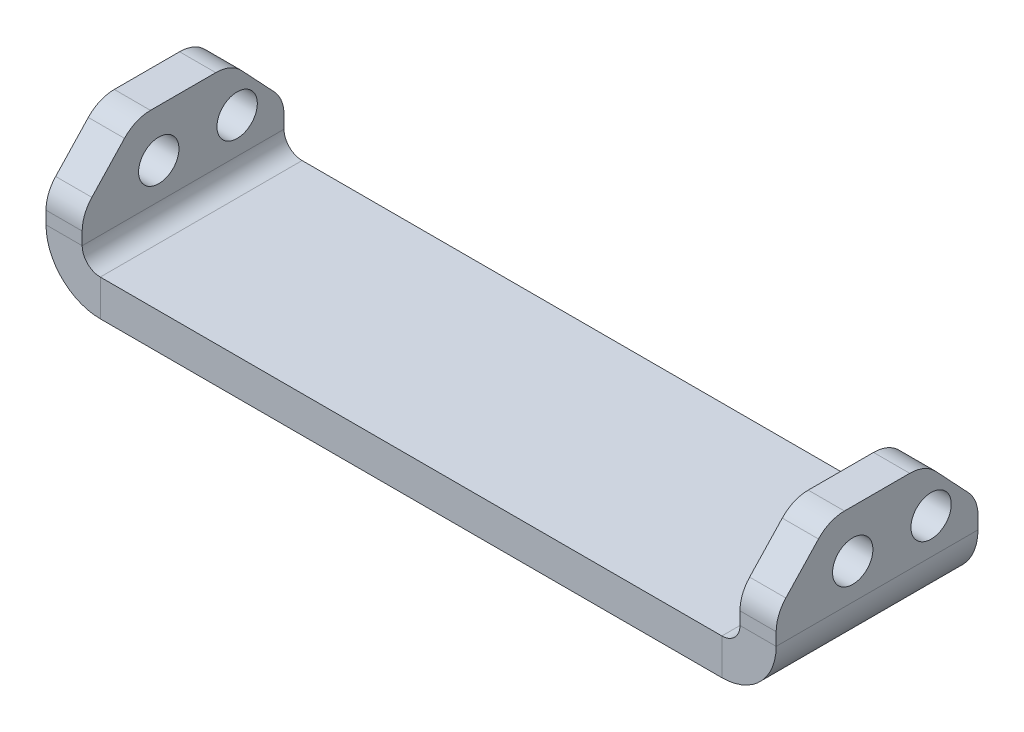
ISO-10303-21;
HEADER;
FILE_DESCRIPTION(('STEP AP214'),'2;1');
FILE_NAME('part.step','',(''),(''),'','','');
FILE_SCHEMA(('AUTOMOTIVE_DESIGN { 1 0 10303 214 1 1 1 1 }'));
ENDSEC;
DATA;
#1=APPLICATION_CONTEXT('core data for automotive mechanical design processes');
#2=APPLICATION_PROTOCOL_DEFINITION('international standard','automotive_design',2000,#1);
#3=PRODUCT_CONTEXT('',#1,'mechanical');
#4=PRODUCT('Part','Part','',(#3));
#5=PRODUCT_RELATED_PRODUCT_CATEGORY('part','',(#4));
#6=PRODUCT_DEFINITION_FORMATION('','',#4);
#7=PRODUCT_DEFINITION_CONTEXT('part definition',#1,'design');
#8=PRODUCT_DEFINITION('design','',#6,#7);
#9=PRODUCT_DEFINITION_SHAPE('','',#8);
#10=(LENGTH_UNIT() NAMED_UNIT(*) SI_UNIT(.MILLI.,.METRE.));
#11=(NAMED_UNIT(*) PLANE_ANGLE_UNIT() SI_UNIT($,.RADIAN.));
#12=(NAMED_UNIT(*) SI_UNIT($,.STERADIAN.) SOLID_ANGLE_UNIT());
#13=UNCERTAINTY_MEASURE_WITH_UNIT(LENGTH_MEASURE(1.E-05),#10,'distance_accuracy_value','');
#14=(GEOMETRIC_REPRESENTATION_CONTEXT(3) GLOBAL_UNCERTAINTY_ASSIGNED_CONTEXT((#13)) GLOBAL_UNIT_ASSIGNED_CONTEXT((#10,
#11,#12)) REPRESENTATION_CONTEXT('',''));
#15=CARTESIAN_POINT('',(0.,0.,0.));
#16=DIRECTION('',(0.,0.,1.));
#17=DIRECTION('',(1.,0.,0.));
#18=AXIS2_PLACEMENT_3D('',#15,#16,#17);
#19=CARTESIAN_POINT('',(0.,15.952,0.));
#20=DIRECTION('',(0.,0.,-1.));
#21=DIRECTION('',(-1.,0.,0.));
#22=AXIS2_PLACEMENT_3D('',#19,#20,#21);
#23=PLANE('',#22);
#24=DIRECTION('',(-1.,0.,0.));
#25=VECTOR('',#24,1.);
#26=CARTESIAN_POINT('',(0.,2.59399999999999,0.));
#27=LINE('',#26,#25);
#28=CARTESIAN_POINT('',(0.,2.59399999999999,0.));
#29=VERTEX_POINT('',#28);
#30=CARTESIAN_POINT('',(3.04799999999999,2.594,0.));
#31=VERTEX_POINT('',#30);
#32=EDGE_CURVE('E95',#29,#31,#27,.F.);
#33=ORIENTED_EDGE('',*,*,#32,.F.);
#34=DIRECTION('',(0.,1.,0.));
#35=VECTOR('',#34,1.);
#36=CARTESIAN_POINT('',(0.,0.,0.));
#37=LINE('',#36,#35);
#38=CARTESIAN_POINT('',(0.,1.52399999999998,0.));
#39=VERTEX_POINT('',#38);
#40=EDGE_CURVE('E313',#39,#29,#37,.T.);
#41=ORIENTED_EDGE('',*,*,#40,.F.);
#42=DIRECTION('',(1.,0.,0.));
#43=VECTOR('',#42,1.);
#44=CARTESIAN_POINT('',(3.04799999999999,1.52399999999999,0.));
#45=LINE('',#44,#43);
#46=CARTESIAN_POINT('',(3.04799999999999,1.52399999999999,0.));
#47=VERTEX_POINT('',#46);
#48=EDGE_CURVE('E324',#47,#39,#45,.F.);
#49=ORIENTED_EDGE('',*,*,#48,.F.);
#50=DIRECTION('',(0.,-1.,0.));
#51=VECTOR('',#50,1.);
#52=CARTESIAN_POINT('',(3.04799999999994,15.952,0.));
#53=LINE('',#52,#51);
#54=EDGE_CURVE('E318',#47,#31,#53,.F.);
#55=ORIENTED_EDGE('',*,*,#54,.T.);
#56=EDGE_LOOP('',(#33,#41,#49,#55));
#57=FACE_BOUND('',#56,.T.);
#58=ADVANCED_FACE('F78',(#57),#23,.F.);
#59=CARTESIAN_POINT('',(0.,0.,0.));
#60=DIRECTION('',(1.,0.,0.));
#61=DIRECTION('',(0.,1.,0.));
#62=AXIS2_PLACEMENT_3D('',#59,#60,#61);
#63=PLANE('',#62);
#64=CARTESIAN_POINT('',(0.,4.52399999999998,-13.05));
#65=DIRECTION('',(-1.,0.,0.));
#66=DIRECTION('',(0.,0.,1.));
#67=AXIS2_PLACEMENT_3D('',#64,#65,#66);
#68=CIRCLE('',#67,1.69999999999999);
#69=CARTESIAN_POINT('',(0.,4.52399999999998,-11.35));
#70=VERTEX_POINT('',#69);
#71=EDGE_CURVE('E941',#70,#70,#68,.T.);
#72=ORIENTED_EDGE('',*,*,#71,.F.);
#73=EDGE_LOOP('',(#72));
#74=FACE_BOUND('',#73,.T.);
#75=CARTESIAN_POINT('',(0.,4.52399999999998,-6.45));
#76=DIRECTION('',(-1.,0.,0.));
#77=DIRECTION('',(0.,0.,1.));
#78=AXIS2_PLACEMENT_3D('',#75,#76,#77);
#79=CIRCLE('',#78,1.69999999999999);
#80=CARTESIAN_POINT('',(0.,4.52399999999998,-4.75000000000001));
#81=VERTEX_POINT('',#80);
#82=EDGE_CURVE('E370',#81,#81,#79,.T.);
#83=ORIENTED_EDGE('',*,*,#82,.F.);
#84=EDGE_LOOP('',(#83));
#85=FACE_BOUND('',#84,.T.);
#86=CARTESIAN_POINT('',(0.,2.59399999999999,-14.));
#87=DIRECTION('',(-1.,0.,0.));
#88=DIRECTION('',(0.,0.,1.));
#89=AXIS2_PLACEMENT_3D('',#86,#87,#88);
#90=CIRCLE('',#89,3.);
#91=CARTESIAN_POINT('',(0.,4.647064751228,-16.1874471713084));
#92=VERTEX_POINT('',#91);
#93=CARTESIAN_POINT('',(0.,2.59399999999999,-17.));
#94=VERTEX_POINT('',#93);
#95=EDGE_CURVE('E445',#92,#94,#90,.T.);
#96=ORIENTED_EDGE('',*,*,#95,.T.);
#97=DIRECTION('',(0.,-1.,0.));
#98=VECTOR('',#97,1.);
#99=CARTESIAN_POINT('',(0.,0.,-17.));
#100=LINE('',#99,#98);
#101=CARTESIAN_POINT('',(0.,1.52399999999998,-17.));
#102=VERTEX_POINT('',#101);
#103=EDGE_CURVE('E310',#94,#102,#100,.T.);
#104=ORIENTED_EDGE('',*,*,#103,.T.);
#105=DIRECTION('',(0.,0.,1.));
#106=VECTOR('',#105,1.);
#107=CARTESIAN_POINT('',(0.,1.52399999999998,-17.));
#108=LINE('',#107,#106);
#109=EDGE_CURVE('E321',#39,#102,#108,.F.);
#110=ORIENTED_EDGE('',*,*,#109,.F.);
#111=ORIENTED_EDGE('',*,*,#40,.T.);
#112=CARTESIAN_POINT('',(0.,2.59399999999999,-3.));
#113=DIRECTION('',(-1.,0.,0.));
#114=DIRECTION('',(0.,0.,1.));
#115=AXIS2_PLACEMENT_3D('',#112,#113,#114);
#116=CIRCLE('',#115,3.);
#117=CARTESIAN_POINT('',(0.,4.647064751228,-0.812552828691611));
#118=VERTEX_POINT('',#117);
#119=EDGE_CURVE('E442',#29,#118,#116,.T.);
#120=ORIENTED_EDGE('',*,*,#119,.T.);
#121=DIRECTION('',(0.,-0.729149057102796,0.684354917076003));
#122=VECTOR('',#121,1.);
#123=CARTESIAN_POINT('',(0.,7.577064751228,-3.56255282869161));
#124=LINE('',#123,#122);
#125=CARTESIAN_POINT('',(0.,7.577064751228,-3.56255282869161));
#126=VERTEX_POINT('',#125);
#127=EDGE_CURVE('E367',#118,#126,#124,.F.);
#128=ORIENTED_EDGE('',*,*,#127,.T.);
#129=CARTESIAN_POINT('',(0.,5.52399999999999,-5.75));
#130=DIRECTION('',(-1.,0.,0.));
#131=DIRECTION('',(0.,0.,1.));
#132=AXIS2_PLACEMENT_3D('',#129,#130,#131);
#133=CIRCLE('',#132,3.);
#134=CARTESIAN_POINT('',(0.,8.52399999999999,-5.75));
#135=VERTEX_POINT('',#134);
#136=EDGE_CURVE('E428',#126,#135,#133,.T.);
#137=ORIENTED_EDGE('',*,*,#136,.T.);
#138=DIRECTION('',(0.,0.,1.));
#139=VECTOR('',#138,1.);
#140=CARTESIAN_POINT('',(0.,8.52399999999999,0.));
#141=LINE('',#140,#139);
#142=CARTESIAN_POINT('',(0.,8.52399999999999,-11.25));
#143=VERTEX_POINT('',#142);
#144=EDGE_CURVE('E454',#135,#143,#141,.F.);
#145=ORIENTED_EDGE('',*,*,#144,.T.);
#146=CARTESIAN_POINT('',(0.,5.52399999999999,-11.25));
#147=DIRECTION('',(-1.,0.,0.));
#148=DIRECTION('',(0.,0.,1.));
#149=AXIS2_PLACEMENT_3D('',#146,#147,#148);
#150=CIRCLE('',#149,3.);
#151=CARTESIAN_POINT('',(0.,7.577064751228,-13.4374471713084));
#152=VERTEX_POINT('',#151);
#153=EDGE_CURVE('E451',#143,#152,#150,.T.);
#154=ORIENTED_EDGE('',*,*,#153,.T.);
#155=DIRECTION('',(0.,0.729149057102796,0.684354917076003));
#156=VECTOR('',#155,1.);
#157=CARTESIAN_POINT('',(0.,4.64706475122799,-16.1874471713084));
#158=LINE('',#157,#156);
#159=EDGE_CURVE('E448',#152,#92,#158,.F.);
#160=ORIENTED_EDGE('',*,*,#159,.T.);
#161=EDGE_LOOP('',(#96,#104,#110,#111,#120,#128,#137,#145,#154,#160));
#162=FACE_BOUND('',#161,.T.);
#163=ADVANCED_FACE('F500',(#74,#85,#162),#63,.F.);
#164=CARTESIAN_POINT('',(3.048,0.,0.));
#165=DIRECTION('',(1.,0.,0.));
#166=DIRECTION('',(0.,1.,0.));
#167=AXIS2_PLACEMENT_3D('',#164,#165,#166);
#168=PLANE('',#167);
#169=CARTESIAN_POINT('',(3.04799999999998,4.52399999999998,-13.05));
#170=DIRECTION('',(1.,0.,0.));
#171=DIRECTION('',(0.,1.,0.));
#172=AXIS2_PLACEMENT_3D('',#169,#170,#171);
#173=CIRCLE('',#172,1.69999999999999);
#174=CARTESIAN_POINT('',(3.04799999999998,6.22399999999997,-13.05));
#175=VERTEX_POINT('',#174);
#176=EDGE_CURVE('E82',#175,#175,#173,.T.);
#177=ORIENTED_EDGE('',*,*,#176,.F.);
#178=EDGE_LOOP('',(#177));
#179=FACE_BOUND('',#178,.T.);
#180=CARTESIAN_POINT('',(3.04799999999998,4.52399999999998,-6.45));
#181=DIRECTION('',(1.,0.,0.));
#182=DIRECTION('',(0.,1.,0.));
#183=AXIS2_PLACEMENT_3D('',#180,#181,#182);
#184=CIRCLE('',#183,1.69999999999999);
#185=CARTESIAN_POINT('',(3.04799999999998,6.22399999999997,-6.45));
#186=VERTEX_POINT('',#185);
#187=EDGE_CURVE('E362',#186,#186,#184,.T.);
#188=ORIENTED_EDGE('',*,*,#187,.F.);
#189=EDGE_LOOP('',(#188));
#190=FACE_BOUND('',#189,.T.);
#191=DIRECTION('',(0.,1.,0.));
#192=VECTOR('',#191,1.);
#193=CARTESIAN_POINT('',(3.048,0.,-17.));
#194=LINE('',#193,#192);
#195=CARTESIAN_POINT('',(3.04799999999999,2.594,-17.));
#196=VERTEX_POINT('',#195);
#197=CARTESIAN_POINT('',(3.04799999999999,1.52399999999999,-17.));
#198=VERTEX_POINT('',#197);
#199=EDGE_CURVE('E316',#196,#198,#194,.F.);
#200=ORIENTED_EDGE('',*,*,#199,.F.);
#201=CARTESIAN_POINT('',(3.04799999999999,2.594,-14.));
#202=DIRECTION('',(-1.,0.,0.));
#203=DIRECTION('',(0.,0.,1.));
#204=AXIS2_PLACEMENT_3D('',#201,#202,#203);
#205=CIRCLE('',#204,3.);
#206=CARTESIAN_POINT('',(3.04799999999998,4.64706475122801,-16.1874471713084));
#207=VERTEX_POINT('',#206);
#208=EDGE_CURVE('E437',#207,#196,#205,.T.);
#209=ORIENTED_EDGE('',*,*,#208,.F.);
#210=DIRECTION('',(0.,0.729149057102796,0.684354917076003));
#211=VECTOR('',#210,1.);
#212=CARTESIAN_POINT('',(3.04799999999998,4.647064751228,-16.1874471713084));
#213=LINE('',#212,#211);
#214=CARTESIAN_POINT('',(3.04799999999997,7.57706475122801,-13.4374471713084));
#215=VERTEX_POINT('',#214);
#216=EDGE_CURVE('E435',#215,#207,#213,.F.);
#217=ORIENTED_EDGE('',*,*,#216,.F.);
#218=CARTESIAN_POINT('',(3.04799999999997,5.524,-11.25));
#219=DIRECTION('',(-1.,0.,0.));
#220=DIRECTION('',(0.,0.,1.));
#221=AXIS2_PLACEMENT_3D('',#218,#219,#220);
#222=CIRCLE('',#221,3.);
#223=CARTESIAN_POINT('',(3.04799999999997,8.524,-11.25));
#224=VERTEX_POINT('',#223);
#225=EDGE_CURVE('E433',#224,#215,#222,.T.);
#226=ORIENTED_EDGE('',*,*,#225,.F.);
#227=DIRECTION('',(0.,0.,1.));
#228=VECTOR('',#227,1.);
#229=CARTESIAN_POINT('',(3.04799999999997,8.524,0.));
#230=LINE('',#229,#228);
#231=CARTESIAN_POINT('',(3.04799999999997,8.524,-5.75));
#232=VERTEX_POINT('',#231);
#233=EDGE_CURVE('E431',#232,#224,#230,.F.);
#234=ORIENTED_EDGE('',*,*,#233,.F.);
#235=CARTESIAN_POINT('',(3.04799999999997,5.524,-5.75));
#236=DIRECTION('',(-1.,0.,0.));
#237=DIRECTION('',(0.,0.,1.));
#238=AXIS2_PLACEMENT_3D('',#235,#236,#237);
#239=CIRCLE('',#238,3.);
#240=CARTESIAN_POINT('',(3.04799999999997,7.57706475122801,-3.56255282869161));
#241=VERTEX_POINT('',#240);
#242=EDGE_CURVE('E429',#241,#232,#239,.T.);
#243=ORIENTED_EDGE('',*,*,#242,.F.);
#244=DIRECTION('',(0.,-0.729149057102796,0.684354917076003));
#245=VECTOR('',#244,1.);
#246=CARTESIAN_POINT('',(3.04799999999997,7.57706475122801,-3.56255282869161));
#247=LINE('',#246,#245);
#248=CARTESIAN_POINT('',(3.04799999999998,4.64706475122801,-0.812552828691611));
#249=VERTEX_POINT('',#248);
#250=EDGE_CURVE('E425',#249,#241,#247,.F.);
#251=ORIENTED_EDGE('',*,*,#250,.F.);
#252=CARTESIAN_POINT('',(3.04799999999999,2.594,-3.));
#253=DIRECTION('',(-1.,0.,0.));
#254=DIRECTION('',(0.,0.,1.));
#255=AXIS2_PLACEMENT_3D('',#252,#253,#254);
#256=CIRCLE('',#255,3.);
#257=EDGE_CURVE('E427',#31,#249,#256,.T.);
#258=ORIENTED_EDGE('',*,*,#257,.F.);
#259=ORIENTED_EDGE('',*,*,#54,.F.);
#260=DIRECTION('',(0.,0.,1.));
#261=VECTOR('',#260,1.);
#262=CARTESIAN_POINT('',(3.04799999999999,1.52399999999999,-17.));
#263=LINE('',#262,#261);
#264=EDGE_CURVE('E327',#198,#47,#263,.T.);
#265=ORIENTED_EDGE('',*,*,#264,.F.);
#266=EDGE_LOOP('',(#200,#209,#217,#226,#234,#243,#251,#258,#259,#265));
#267=FACE_BOUND('',#266,.T.);
#268=ADVANCED_FACE('F485',(#179,#190,#267),#168,.T.);
#269=CARTESIAN_POINT('',(61.5,15.952,-17.));
#270=DIRECTION('',(0.,0.,1.));
#271=DIRECTION('',(0.,-1.,0.));
#272=AXIS2_PLACEMENT_3D('',#269,#270,#271);
#273=PLANE('',#272);
#274=DIRECTION('',(-1.,0.,0.));
#275=VECTOR('',#274,1.);
#276=CARTESIAN_POINT('',(58.452,2.59399999999999,-17.));
#277=LINE('',#276,#275);
#278=CARTESIAN_POINT('',(58.452,2.59399999999999,-17.));
#279=VERTEX_POINT('',#278);
#280=CARTESIAN_POINT('',(61.5,2.59399999999998,-17.));
#281=VERTEX_POINT('',#280);
#282=EDGE_CURVE('E243',#279,#281,#277,.F.);
#283=ORIENTED_EDGE('',*,*,#282,.T.);
#284=DIRECTION('',(0.,1.,0.));
#285=VECTOR('',#284,1.);
#286=CARTESIAN_POINT('',(61.5,-2.2095768222079E-13,-17.));
#287=LINE('',#286,#285);
#288=CARTESIAN_POINT('',(61.5,1.52399999999999,-17.));
#289=VERTEX_POINT('',#288);
#290=EDGE_CURVE('E256',#289,#281,#287,.T.);
#291=ORIENTED_EDGE('',*,*,#290,.F.);
#292=DIRECTION('',(-1.,0.,0.));
#293=VECTOR('',#292,1.);
#294=CARTESIAN_POINT('',(58.452,1.524,-17.));
#295=LINE('',#294,#293);
#296=CARTESIAN_POINT('',(58.452,1.524,-17.));
#297=VERTEX_POINT('',#296);
#298=EDGE_CURVE('E281',#297,#289,#295,.F.);
#299=ORIENTED_EDGE('',*,*,#298,.F.);
#300=DIRECTION('',(0.,-1.,0.));
#301=VECTOR('',#300,1.);
#302=CARTESIAN_POINT('',(58.4520000000001,15.952,-17.));
#303=LINE('',#302,#301);
#304=EDGE_CURVE('E258',#297,#279,#303,.F.);
#305=ORIENTED_EDGE('',*,*,#304,.T.);
#306=EDGE_LOOP('',(#283,#291,#299,#305));
#307=FACE_BOUND('',#306,.T.);
#308=ADVANCED_FACE('F254',(#307),#273,.F.);
#309=CARTESIAN_POINT('',(61.5,-2.24655061745816E-13,0.));
#310=DIRECTION('',(-1.,0.,0.));
#311=DIRECTION('',(0.,-1.,0.));
#312=AXIS2_PLACEMENT_3D('',#309,#310,#311);
#313=PLANE('',#312);
#314=CARTESIAN_POINT('',(61.5000000000001,4.52399999999998,-13.05));
#315=DIRECTION('',(-1.,0.,0.));
#316=DIRECTION('',(0.,0.,1.));
#317=AXIS2_PLACEMENT_3D('',#314,#315,#316);
#318=CIRCLE('',#317,1.69999999999998);
#319=CARTESIAN_POINT('',(61.5000000000001,4.52399999999998,-11.35));
#320=VERTEX_POINT('',#319);
#321=EDGE_CURVE('E940',#320,#320,#318,.T.);
#322=ORIENTED_EDGE('',*,*,#321,.T.);
#323=EDGE_LOOP('',(#322));
#324=FACE_BOUND('',#323,.T.);
#325=CARTESIAN_POINT('',(61.5000000000001,4.52399999999998,-6.45));
#326=DIRECTION('',(-1.,0.,0.));
#327=DIRECTION('',(0.,0.,1.));
#328=AXIS2_PLACEMENT_3D('',#325,#326,#327);
#329=CIRCLE('',#328,1.69999999999998);
#330=CARTESIAN_POINT('',(61.5000000000001,4.52399999999998,-4.75000000000002));
#331=VERTEX_POINT('',#330);
#332=EDGE_CURVE('E363',#331,#331,#329,.T.);
#333=ORIENTED_EDGE('',*,*,#332,.T.);
#334=EDGE_LOOP('',(#333));
#335=FACE_BOUND('',#334,.T.);
#336=CARTESIAN_POINT('',(61.5,2.59399999999998,-3.));
#337=DIRECTION('',(-1.,0.,0.));
#338=DIRECTION('',(0.,-1.,0.));
#339=AXIS2_PLACEMENT_3D('',#336,#337,#338);
#340=CIRCLE('',#339,3.);
#341=CARTESIAN_POINT('',(61.5,2.59399999999998,0.));
#342=VERTEX_POINT('',#341);
#343=CARTESIAN_POINT('',(61.5,4.64706475122798,-0.812552828691611));
#344=VERTEX_POINT('',#343);
#345=EDGE_CURVE('E379',#342,#344,#340,.T.);
#346=ORIENTED_EDGE('',*,*,#345,.F.);
#347=DIRECTION('',(0.,-1.,0.));
#348=VECTOR('',#347,1.);
#349=CARTESIAN_POINT('',(61.5,-2.24655061745816E-13,0.));
#350=LINE('',#349,#348);
#351=CARTESIAN_POINT('',(61.5,1.52399999999999,0.));
#352=VERTEX_POINT('',#351);
#353=EDGE_CURVE('E267',#342,#352,#350,.T.);
#354=ORIENTED_EDGE('',*,*,#353,.T.);
#355=DIRECTION('',(0.,0.,-1.));
#356=VECTOR('',#355,1.);
#357=CARTESIAN_POINT('',(61.5,1.52399999999999,0.));
#358=LINE('',#357,#356);
#359=EDGE_CURVE('E265',#289,#352,#358,.F.);
#360=ORIENTED_EDGE('',*,*,#359,.F.);
#361=ORIENTED_EDGE('',*,*,#290,.T.);
#362=CARTESIAN_POINT('',(61.5,2.59399999999998,-14.));
#363=DIRECTION('',(-1.,0.,0.));
#364=DIRECTION('',(0.,-1.,0.));
#365=AXIS2_PLACEMENT_3D('',#362,#363,#364);
#366=CIRCLE('',#365,3.);
#367=CARTESIAN_POINT('',(61.5,4.64706475122798,-16.1874471713084));
#368=VERTEX_POINT('',#367);
#369=EDGE_CURVE('E240',#368,#281,#366,.T.);
#370=ORIENTED_EDGE('',*,*,#369,.F.);
#371=DIRECTION('',(0.,-0.729149057102796,-0.684354917076003));
#372=VECTOR('',#371,1.);
#373=CARTESIAN_POINT('',(61.5,10.2538973930154,-10.925061586013));
#374=LINE('',#373,#372);
#375=CARTESIAN_POINT('',(61.5,7.57706475122799,-13.4374471713084));
#376=VERTEX_POINT('',#375);
#377=EDGE_CURVE('E248',#376,#368,#374,.T.);
#378=ORIENTED_EDGE('',*,*,#377,.F.);
#379=CARTESIAN_POINT('',(61.5,5.52399999999998,-11.25));
#380=DIRECTION('',(-1.,0.,0.));
#381=DIRECTION('',(0.,-1.,0.));
#382=AXIS2_PLACEMENT_3D('',#379,#380,#381);
#383=CIRCLE('',#382,3.);
#384=CARTESIAN_POINT('',(61.5,8.52399999999998,-11.25));
#385=VERTEX_POINT('',#384);
#386=EDGE_CURVE('E387',#385,#376,#383,.T.);
#387=ORIENTED_EDGE('',*,*,#386,.F.);
#388=DIRECTION('',(0.,0.,1.));
#389=VECTOR('',#388,1.);
#390=CARTESIAN_POINT('',(61.5,8.52399999999998,0.));
#391=LINE('',#390,#389);
#392=CARTESIAN_POINT('',(61.5,8.52399999999998,-5.75));
#393=VERTEX_POINT('',#392);
#394=EDGE_CURVE('E385',#393,#385,#391,.F.);
#395=ORIENTED_EDGE('',*,*,#394,.F.);
#396=CARTESIAN_POINT('',(61.5,5.52399999999998,-5.75));
#397=DIRECTION('',(-1.,0.,0.));
#398=DIRECTION('',(0.,-1.,0.));
#399=AXIS2_PLACEMENT_3D('',#396,#397,#398);
#400=CIRCLE('',#399,3.);
#401=CARTESIAN_POINT('',(61.5,7.57706475122799,-3.56255282869161));
#402=VERTEX_POINT('',#401);
#403=EDGE_CURVE('E383',#402,#393,#400,.T.);
#404=ORIENTED_EDGE('',*,*,#403,.F.);
#405=DIRECTION('',(0.,0.729149057102796,-0.684354917076003));
#406=VECTOR('',#405,1.);
#407=CARTESIAN_POINT('',(61.5,1.7709527703517,1.88686967895678));
#408=LINE('',#407,#406);
#409=EDGE_CURVE('E381',#344,#402,#408,.T.);
#410=ORIENTED_EDGE('',*,*,#409,.F.);
#411=EDGE_LOOP('',(#346,#354,#360,#361,#370,#378,#387,#395,#404,#410));
#412=FACE_BOUND('',#411,.T.);
#413=ADVANCED_FACE('F263',(#324,#335,#412),#313,.F.);
#414=CARTESIAN_POINT('',(58.452,-2.14013026625022E-13,0.));
#415=DIRECTION('',(-1.,0.,0.));
#416=DIRECTION('',(0.,-1.,0.));
#417=AXIS2_PLACEMENT_3D('',#414,#415,#416);
#418=PLANE('',#417);
#419=CARTESIAN_POINT('',(58.452,4.52399999999998,-13.05));
#420=DIRECTION('',(-1.,0.,0.));
#421=DIRECTION('',(0.,-1.,0.));
#422=AXIS2_PLACEMENT_3D('',#419,#420,#421);
#423=CIRCLE('',#422,1.69999999999999);
#424=CARTESIAN_POINT('',(58.452,2.824,-13.05));
#425=VERTEX_POINT('',#424);
#426=EDGE_CURVE('E375',#425,#425,#423,.T.);
#427=ORIENTED_EDGE('',*,*,#426,.F.);
#428=EDGE_LOOP('',(#427));
#429=FACE_BOUND('',#428,.T.);
#430=CARTESIAN_POINT('',(58.452,4.52399999999998,-6.45));
#431=DIRECTION('',(-1.,0.,0.));
#432=DIRECTION('',(0.,-1.,0.));
#433=AXIS2_PLACEMENT_3D('',#430,#431,#432);
#434=CIRCLE('',#433,1.69999999999999);
#435=CARTESIAN_POINT('',(58.452,2.824,-6.45));
#436=VERTEX_POINT('',#435);
#437=EDGE_CURVE('E360',#436,#436,#434,.T.);
#438=ORIENTED_EDGE('',*,*,#437,.F.);
#439=EDGE_LOOP('',(#438));
#440=FACE_BOUND('',#439,.T.);
#441=DIRECTION('',(0.,1.,0.));
#442=VECTOR('',#441,1.);
#443=CARTESIAN_POINT('',(58.452,0.,0.));
#444=LINE('',#443,#442);
#445=CARTESIAN_POINT('',(58.452,2.59399999999999,0.));
#446=VERTEX_POINT('',#445);
#447=CARTESIAN_POINT('',(58.452,1.524,0.));
#448=VERTEX_POINT('',#447);
#449=EDGE_CURVE('E278',#446,#448,#444,.F.);
#450=ORIENTED_EDGE('',*,*,#449,.F.);
#451=CARTESIAN_POINT('',(58.452,2.59399999999999,-3.));
#452=DIRECTION('',(-1.,0.,0.));
#453=DIRECTION('',(0.,-1.,0.));
#454=AXIS2_PLACEMENT_3D('',#451,#452,#453);
#455=CIRCLE('',#454,3.);
#456=CARTESIAN_POINT('',(58.452,4.64706475122799,-0.812552828691611));
#457=VERTEX_POINT('',#456);
#458=EDGE_CURVE('E249',#446,#457,#455,.T.);
#459=ORIENTED_EDGE('',*,*,#458,.T.);
#460=DIRECTION('',(0.,0.729149057102796,-0.684354917076003));
#461=VECTOR('',#460,1.);
#462=CARTESIAN_POINT('',(58.452,1.77095277035171,1.88686967895678));
#463=LINE('',#462,#461);
#464=CARTESIAN_POINT('',(58.452,7.577064751228,-3.56255282869161));
#465=VERTEX_POINT('',#464);
#466=EDGE_CURVE('E404',#457,#465,#463,.T.);
#467=ORIENTED_EDGE('',*,*,#466,.T.);
#468=CARTESIAN_POINT('',(58.452,5.52399999999999,-5.75));
#469=DIRECTION('',(-1.,0.,0.));
#470=DIRECTION('',(0.,-1.,0.));
#471=AXIS2_PLACEMENT_3D('',#468,#469,#470);
#472=CIRCLE('',#471,3.);
#473=CARTESIAN_POINT('',(58.452,8.52399999999999,-5.75));
#474=VERTEX_POINT('',#473);
#475=EDGE_CURVE('E401',#465,#474,#472,.T.);
#476=ORIENTED_EDGE('',*,*,#475,.T.);
#477=DIRECTION('',(0.,0.,-1.));
#478=VECTOR('',#477,1.);
#479=CARTESIAN_POINT('',(58.452,8.52399999999999,0.));
#480=LINE('',#479,#478);
#481=CARTESIAN_POINT('',(58.452,8.52399999999999,-11.25));
#482=VERTEX_POINT('',#481);
#483=EDGE_CURVE('E398',#474,#482,#480,.T.);
#484=ORIENTED_EDGE('',*,*,#483,.T.);
#485=CARTESIAN_POINT('',(58.452,5.52399999999999,-11.25));
#486=DIRECTION('',(-1.,0.,0.));
#487=DIRECTION('',(0.,-1.,0.));
#488=AXIS2_PLACEMENT_3D('',#485,#486,#487);
#489=CIRCLE('',#488,3.);
#490=CARTESIAN_POINT('',(58.452,7.577064751228,-13.4374471713084));
#491=VERTEX_POINT('',#490);
#492=EDGE_CURVE('E395',#482,#491,#489,.T.);
#493=ORIENTED_EDGE('',*,*,#492,.T.);
#494=DIRECTION('',(0.,-0.729149057102796,-0.684354917076003));
#495=VECTOR('',#494,1.);
#496=CARTESIAN_POINT('',(58.452,10.2538973930154,-10.925061586013));
#497=LINE('',#496,#495);
#498=CARTESIAN_POINT('',(58.452,4.64706475122798,-16.1874471713084));
#499=VERTEX_POINT('',#498);
#500=EDGE_CURVE('E392',#491,#499,#497,.T.);
#501=ORIENTED_EDGE('',*,*,#500,.T.);
#502=CARTESIAN_POINT('',(58.452,2.59399999999999,-14.));
#503=DIRECTION('',(-1.,0.,0.));
#504=DIRECTION('',(0.,-1.,0.));
#505=AXIS2_PLACEMENT_3D('',#502,#503,#504);
#506=CIRCLE('',#505,3.);
#507=EDGE_CURVE('E390',#499,#279,#506,.T.);
#508=ORIENTED_EDGE('',*,*,#507,.T.);
#509=ORIENTED_EDGE('',*,*,#304,.F.);
#510=DIRECTION('',(0.,0.,-1.));
#511=VECTOR('',#510,1.);
#512=CARTESIAN_POINT('',(58.452,1.524,0.));
#513=LINE('',#512,#511);
#514=EDGE_CURVE('E284',#448,#297,#513,.T.);
#515=ORIENTED_EDGE('',*,*,#514,.F.);
#516=EDGE_LOOP('',(#450,#459,#467,#476,#484,#493,#501,#508,#509,#515));
#517=FACE_BOUND('',#516,.T.);
#518=ADVANCED_FACE('F533',(#429,#440,#517),#418,.T.);
#519=CARTESIAN_POINT('',(0.,-3.048,0.));
#520=DIRECTION('',(0.,-1.,0.));
#521=DIRECTION('',(0.,0.,-1.));
#522=AXIS2_PLACEMENT_3D('',#519,#520,#521);
#523=PLANE('',#522);
#524=DIRECTION('',(-1.,0.,0.));
#525=VECTOR('',#524,1.);
#526=CARTESIAN_POINT('',(0.,-3.048,-17.));
#527=LINE('',#526,#525);
#528=CARTESIAN_POINT('',(56.928,-3.048,-17.));
#529=VERTEX_POINT('',#528);
#530=CARTESIAN_POINT('',(4.57199999999999,-3.048,-17.));
#531=VERTEX_POINT('',#530);
#532=EDGE_CURVE('E13',#529,#531,#527,.T.);
#533=ORIENTED_EDGE('',*,*,#532,.F.);
#534=DIRECTION('',(0.,0.,-1.));
#535=VECTOR('',#534,1.);
#536=CARTESIAN_POINT('',(56.928,-3.048,-17.));
#537=LINE('',#536,#535);
#538=CARTESIAN_POINT('',(56.928,-3.048,0.));
#539=VERTEX_POINT('',#538);
#540=EDGE_CURVE('E290',#529,#539,#537,.F.);
#541=ORIENTED_EDGE('',*,*,#540,.T.);
#542=DIRECTION('',(1.,0.,0.));
#543=VECTOR('',#542,1.);
#544=CARTESIAN_POINT('',(0.,-3.048,0.));
#545=LINE('',#544,#543);
#546=CARTESIAN_POINT('',(4.572,-3.048,0.));
#547=VERTEX_POINT('',#546);
#548=EDGE_CURVE('E87',#547,#539,#545,.T.);
#549=ORIENTED_EDGE('',*,*,#548,.F.);
#550=DIRECTION('',(0.,0.,1.));
#551=VECTOR('',#550,1.);
#552=CARTESIAN_POINT('',(4.572,-3.048,0.));
#553=LINE('',#552,#551);
#554=EDGE_CURVE('E331',#547,#531,#553,.F.);
#555=ORIENTED_EDGE('',*,*,#554,.T.);
#556=EDGE_LOOP('',(#533,#541,#549,#555));
#557=FACE_BOUND('',#556,.T.);
#558=ADVANCED_FACE('F512',(#557),#523,.T.);
#559=CARTESIAN_POINT('',(0.,0.,0.));
#560=DIRECTION('',(0.,-1.,0.));
#561=DIRECTION('',(0.,0.,-1.));
#562=AXIS2_PLACEMENT_3D('',#559,#560,#561);
#563=PLANE('',#562);
#564=DIRECTION('',(0.,0.,-1.));
#565=VECTOR('',#564,1.);
#566=CARTESIAN_POINT('',(56.928,0.,-17.));
#567=LINE('',#566,#565);
#568=CARTESIAN_POINT('',(56.928,0.,-17.));
#569=VERTEX_POINT('',#568);
#570=CARTESIAN_POINT('',(56.928,0.,0.));
#571=VERTEX_POINT('',#570);
#572=EDGE_CURVE('E270',#569,#571,#567,.F.);
#573=ORIENTED_EDGE('',*,*,#572,.F.);
#574=DIRECTION('',(-1.,0.,0.));
#575=VECTOR('',#574,1.);
#576=CARTESIAN_POINT('',(0.,0.,-17.));
#577=LINE('',#576,#575);
#578=CARTESIAN_POINT('',(4.57199999999999,0.,-17.));
#579=VERTEX_POINT('',#578);
#580=EDGE_CURVE('E355',#569,#579,#577,.T.);
#581=ORIENTED_EDGE('',*,*,#580,.T.);
#582=DIRECTION('',(0.,0.,1.));
#583=VECTOR('',#582,1.);
#584=CARTESIAN_POINT('',(4.57199999999999,0.,0.));
#585=LINE('',#584,#583);
#586=CARTESIAN_POINT('',(4.57199999999999,0.,0.));
#587=VERTEX_POINT('',#586);
#588=EDGE_CURVE('E344',#587,#579,#585,.F.);
#589=ORIENTED_EDGE('',*,*,#588,.F.);
#590=DIRECTION('',(1.,0.,0.));
#591=VECTOR('',#590,1.);
#592=CARTESIAN_POINT('',(0.,0.,0.));
#593=LINE('',#592,#591);
#594=EDGE_CURVE('E351',#587,#571,#593,.T.);
#595=ORIENTED_EDGE('',*,*,#594,.T.);
#596=EDGE_LOOP('',(#573,#581,#589,#595));
#597=FACE_BOUND('',#596,.T.);
#598=ADVANCED_FACE('F518',(#597),#563,.F.);
#599=CARTESIAN_POINT('',(0.,-3.048,-17.));
#600=DIRECTION('',(0.,0.,-1.));
#601=DIRECTION('',(-1.,0.,0.));
#602=AXIS2_PLACEMENT_3D('',#599,#600,#601);
#603=PLANE('',#602);
#604=ORIENTED_EDGE('',*,*,#580,.F.);
#605=DIRECTION('',(0.,-1.,0.));
#606=VECTOR('',#605,1.);
#607=CARTESIAN_POINT('',(56.928,0.,-17.));
#608=LINE('',#607,#606);
#609=EDGE_CURVE('E297',#569,#529,#608,.T.);
#610=ORIENTED_EDGE('',*,*,#609,.T.);
#611=ORIENTED_EDGE('',*,*,#532,.T.);
#612=DIRECTION('',(0.,-1.,0.));
#613=VECTOR('',#612,1.);
#614=CARTESIAN_POINT('',(4.57199999999999,0.,-17.));
#615=LINE('',#614,#613);
#616=EDGE_CURVE('E348',#579,#531,#615,.T.);
#617=ORIENTED_EDGE('',*,*,#616,.F.);
#618=EDGE_LOOP('',(#604,#610,#611,#617));
#619=FACE_BOUND('',#618,.T.);
#620=ADVANCED_FACE('F509',(#619),#603,.T.);
#621=CARTESIAN_POINT('',(0.,-3.048,0.));
#622=DIRECTION('',(0.,0.,1.));
#623=DIRECTION('',(1.,0.,0.));
#624=AXIS2_PLACEMENT_3D('',#621,#622,#623);
#625=PLANE('',#624);
#626=DIRECTION('',(0.,-1.,0.));
#627=VECTOR('',#626,1.);
#628=CARTESIAN_POINT('',(56.928,0.,0.));
#629=LINE('',#628,#627);
#630=EDGE_CURVE('E304',#571,#539,#629,.T.);
#631=ORIENTED_EDGE('',*,*,#630,.F.);
#632=ORIENTED_EDGE('',*,*,#594,.F.);
#633=DIRECTION('',(0.,-1.,0.));
#634=VECTOR('',#633,1.);
#635=CARTESIAN_POINT('',(4.57199999999999,0.,0.));
#636=LINE('',#635,#634);
#637=EDGE_CURVE('E338',#587,#547,#636,.T.);
#638=ORIENTED_EDGE('',*,*,#637,.T.);
#639=ORIENTED_EDGE('',*,*,#548,.T.);
#640=EDGE_LOOP('',(#631,#632,#638,#639));
#641=FACE_BOUND('',#640,.T.);
#642=ADVANCED_FACE('F80',(#641),#625,.T.);
#643=CARTESIAN_POINT('',(4.57199999999999,1.524,-17.));
#644=DIRECTION('',(0.,0.,-1.));
#645=DIRECTION('',(-1.,0.,0.));
#646=AXIS2_PLACEMENT_3D('',#643,#644,#645);
#647=PLANE('',#646);
#648=DIRECTION('',(1.,0.,0.));
#649=VECTOR('',#648,1.);
#650=CARTESIAN_POINT('',(0.,1.52399999999998,-17.));
#651=LINE('',#650,#649);
#652=EDGE_CURVE('E307',#198,#102,#651,.F.);
#653=ORIENTED_EDGE('',*,*,#652,.F.);
#654=CARTESIAN_POINT('',(4.57199999999999,1.524,-17.));
#655=DIRECTION('',(0.,0.,1.));
#656=DIRECTION('',(1.,0.,0.));
#657=AXIS2_PLACEMENT_3D('',#654,#655,#656);
#658=CIRCLE('',#657,1.524);
#659=EDGE_CURVE('E341',#579,#198,#658,.F.);
#660=ORIENTED_EDGE('',*,*,#659,.F.);
#661=ORIENTED_EDGE('',*,*,#616,.T.);
#662=CARTESIAN_POINT('',(4.57199999999999,1.524,-17.));
#663=DIRECTION('',(0.,0.,1.));
#664=DIRECTION('',(1.,0.,0.));
#665=AXIS2_PLACEMENT_3D('',#662,#663,#664);
#666=CIRCLE('',#665,4.572);
#667=EDGE_CURVE('E334',#531,#102,#666,.F.);
#668=ORIENTED_EDGE('',*,*,#667,.T.);
#669=EDGE_LOOP('',(#653,#660,#661,#668));
#670=FACE_BOUND('',#669,.T.);
#671=ADVANCED_FACE('F504',(#670),#647,.T.);
#672=CARTESIAN_POINT('',(4.57199999999999,1.524,0.));
#673=DIRECTION('',(0.,0.,-1.));
#674=DIRECTION('',(-1.,0.,0.));
#675=AXIS2_PLACEMENT_3D('',#672,#673,#674);
#676=PLANE('',#675);
#677=CARTESIAN_POINT('',(4.57199999999999,1.524,0.));
#678=DIRECTION('',(0.,0.,1.));
#679=DIRECTION('',(1.,0.,0.));
#680=AXIS2_PLACEMENT_3D('',#677,#678,#679);
#681=CIRCLE('',#680,1.524);
#682=EDGE_CURVE('E312',#47,#587,#681,.T.);
#683=ORIENTED_EDGE('',*,*,#682,.F.);
#684=ORIENTED_EDGE('',*,*,#48,.T.);
#685=CARTESIAN_POINT('',(4.57199999999999,1.524,0.));
#686=DIRECTION('',(0.,0.,1.));
#687=DIRECTION('',(1.,0.,0.));
#688=AXIS2_PLACEMENT_3D('',#685,#686,#687);
#689=CIRCLE('',#688,4.572);
#690=EDGE_CURVE('E335',#39,#547,#689,.T.);
#691=ORIENTED_EDGE('',*,*,#690,.T.);
#692=ORIENTED_EDGE('',*,*,#637,.F.);
#693=EDGE_LOOP('',(#683,#684,#691,#692));
#694=FACE_BOUND('',#693,.T.);
#695=ADVANCED_FACE('F495',(#694),#676,.F.);
#696=CARTESIAN_POINT('',(4.57199999999999,1.524,0.));
#697=DIRECTION('',(0.,0.,1.));
#698=DIRECTION('',(-1.,0.,0.));
#699=AXIS2_PLACEMENT_3D('',#696,#697,#698);
#700=CYLINDRICAL_SURFACE('',#699,4.572);
#701=ORIENTED_EDGE('',*,*,#554,.F.);
#702=ORIENTED_EDGE('',*,*,#690,.F.);
#703=ORIENTED_EDGE('',*,*,#109,.T.);
#704=ORIENTED_EDGE('',*,*,#667,.F.);
#705=EDGE_LOOP('',(#701,#702,#703,#704));
#706=FACE_BOUND('',#705,.T.);
#707=ADVANCED_FACE('F502',(#706),#700,.T.);
#708=CARTESIAN_POINT('',(4.57199999999999,1.524,0.));
#709=DIRECTION('',(0.,0.,1.));
#710=DIRECTION('',(-1.,0.,0.));
#711=AXIS2_PLACEMENT_3D('',#708,#709,#710);
#712=CYLINDRICAL_SURFACE('',#711,1.524);
#713=ORIENTED_EDGE('',*,*,#588,.T.);
#714=ORIENTED_EDGE('',*,*,#659,.T.);
#715=ORIENTED_EDGE('',*,*,#264,.T.);
#716=ORIENTED_EDGE('',*,*,#682,.T.);
#717=EDGE_LOOP('',(#713,#714,#715,#716));
#718=FACE_BOUND('',#717,.T.);
#719=ADVANCED_FACE('F490',(#718),#712,.F.);
#720=CARTESIAN_POINT('',(0.,0.,-17.));
#721=DIRECTION('',(0.,0.,1.));
#722=DIRECTION('',(1.,0.,0.));
#723=AXIS2_PLACEMENT_3D('',#720,#721,#722);
#724=PLANE('',#723);
#725=ORIENTED_EDGE('',*,*,#103,.F.);
#726=DIRECTION('',(-1.,0.,0.));
#727=VECTOR('',#726,1.);
#728=CARTESIAN_POINT('',(0.,2.59399999999999,-17.));
#729=LINE('',#728,#727);
#730=EDGE_CURVE('E474',#94,#196,#729,.F.);
#731=ORIENTED_EDGE('',*,*,#730,.T.);
#732=ORIENTED_EDGE('',*,*,#199,.T.);
#733=ORIENTED_EDGE('',*,*,#652,.T.);
#734=EDGE_LOOP('',(#725,#731,#732,#733));
#735=FACE_BOUND('',#734,.T.);
#736=ADVANCED_FACE('F479',(#735),#724,.F.);
#737=CARTESIAN_POINT('',(56.928,1.524,0.));
#738=DIRECTION('',(0.,0.,1.));
#739=DIRECTION('',(1.,0.,0.));
#740=AXIS2_PLACEMENT_3D('',#737,#738,#739);
#741=PLANE('',#740);
#742=DIRECTION('',(-1.,0.,0.));
#743=VECTOR('',#742,1.);
#744=CARTESIAN_POINT('',(61.5,1.52399999999999,0.));
#745=LINE('',#744,#743);
#746=EDGE_CURVE('E286',#448,#352,#745,.F.);
#747=ORIENTED_EDGE('',*,*,#746,.F.);
#748=CARTESIAN_POINT('',(56.928,1.524,0.));
#749=DIRECTION('',(0.,0.,-1.));
#750=DIRECTION('',(-1.,0.,0.));
#751=AXIS2_PLACEMENT_3D('',#748,#749,#750);
#752=CIRCLE('',#751,1.524);
#753=EDGE_CURVE('E300',#571,#448,#752,.F.);
#754=ORIENTED_EDGE('',*,*,#753,.F.);
#755=ORIENTED_EDGE('',*,*,#630,.T.);
#756=CARTESIAN_POINT('',(56.928,1.524,0.));
#757=DIRECTION('',(0.,0.,-1.));
#758=DIRECTION('',(-1.,0.,0.));
#759=AXIS2_PLACEMENT_3D('',#756,#757,#758);
#760=CIRCLE('',#759,4.572);
#761=EDGE_CURVE('E293',#539,#352,#760,.F.);
#762=ORIENTED_EDGE('',*,*,#761,.T.);
#763=EDGE_LOOP('',(#747,#754,#755,#762));
#764=FACE_BOUND('',#763,.T.);
#765=ADVANCED_FACE('F526',(#764),#741,.T.);
#766=CARTESIAN_POINT('',(56.928,1.524,-17.));
#767=DIRECTION('',(0.,0.,1.));
#768=DIRECTION('',(1.,0.,0.));
#769=AXIS2_PLACEMENT_3D('',#766,#767,#768);
#770=PLANE('',#769);
#771=CARTESIAN_POINT('',(56.928,1.524,-17.));
#772=DIRECTION('',(0.,0.,-1.));
#773=DIRECTION('',(-1.,0.,0.));
#774=AXIS2_PLACEMENT_3D('',#771,#772,#773);
#775=CIRCLE('',#774,1.524);
#776=EDGE_CURVE('E266',#297,#569,#775,.T.);
#777=ORIENTED_EDGE('',*,*,#776,.F.);
#778=ORIENTED_EDGE('',*,*,#298,.T.);
#779=CARTESIAN_POINT('',(56.928,1.524,-17.));
#780=DIRECTION('',(0.,0.,-1.));
#781=DIRECTION('',(-1.,0.,0.));
#782=AXIS2_PLACEMENT_3D('',#779,#780,#781);
#783=CIRCLE('',#782,4.572);
#784=EDGE_CURVE('E294',#289,#529,#783,.T.);
#785=ORIENTED_EDGE('',*,*,#784,.T.);
#786=ORIENTED_EDGE('',*,*,#609,.F.);
#787=EDGE_LOOP('',(#777,#778,#785,#786));
#788=FACE_BOUND('',#787,.T.);
#789=ADVANCED_FACE('F535',(#788),#770,.F.);
#790=CARTESIAN_POINT('',(56.928,1.524,-17.));
#791=DIRECTION('',(0.,0.,-1.));
#792=DIRECTION('',(1.,0.,0.));
#793=AXIS2_PLACEMENT_3D('',#790,#791,#792);
#794=CYLINDRICAL_SURFACE('',#793,4.572);
#795=ORIENTED_EDGE('',*,*,#540,.F.);
#796=ORIENTED_EDGE('',*,*,#784,.F.);
#797=ORIENTED_EDGE('',*,*,#359,.T.);
#798=ORIENTED_EDGE('',*,*,#761,.F.);
#799=EDGE_LOOP('',(#795,#796,#797,#798));
#800=FACE_BOUND('',#799,.T.);
#801=ADVANCED_FACE('F537',(#800),#794,.T.);
#802=CARTESIAN_POINT('',(56.928,1.524,-17.));
#803=DIRECTION('',(0.,0.,-1.));
#804=DIRECTION('',(1.,0.,0.));
#805=AXIS2_PLACEMENT_3D('',#802,#803,#804);
#806=CYLINDRICAL_SURFACE('',#805,1.524);
#807=ORIENTED_EDGE('',*,*,#572,.T.);
#808=ORIENTED_EDGE('',*,*,#753,.T.);
#809=ORIENTED_EDGE('',*,*,#514,.T.);
#810=ORIENTED_EDGE('',*,*,#776,.T.);
#811=EDGE_LOOP('',(#807,#808,#809,#810));
#812=FACE_BOUND('',#811,.T.);
#813=ADVANCED_FACE('F521',(#812),#806,.F.);
#814=CARTESIAN_POINT('',(61.5,0.,0.));
#815=DIRECTION('',(0.,0.,-1.));
#816=DIRECTION('',(-1.,0.,0.));
#817=AXIS2_PLACEMENT_3D('',#814,#815,#816);
#818=PLANE('',#817);
#819=ORIENTED_EDGE('',*,*,#353,.F.);
#820=DIRECTION('',(-1.,0.,0.));
#821=VECTOR('',#820,1.);
#822=CARTESIAN_POINT('',(58.452,2.59399999999999,0.));
#823=LINE('',#822,#821);
#824=EDGE_CURVE('E259',#446,#342,#823,.F.);
#825=ORIENTED_EDGE('',*,*,#824,.F.);
#826=ORIENTED_EDGE('',*,*,#449,.T.);
#827=ORIENTED_EDGE('',*,*,#746,.T.);
#828=EDGE_LOOP('',(#819,#825,#826,#827));
#829=FACE_BOUND('',#828,.T.);
#830=ADVANCED_FACE('F529',(#829),#818,.F.);
#831=CARTESIAN_POINT('',(58.452,5.52399999999999,-11.25));
#832=DIRECTION('',(-1.,0.,0.));
#833=DIRECTION('',(0.,-1.,0.));
#834=AXIS2_PLACEMENT_3D('',#831,#832,#833);
#835=CYLINDRICAL_SURFACE('',#834,3.);
#836=DIRECTION('',(-1.,0.,0.));
#837=VECTOR('',#836,1.);
#838=CARTESIAN_POINT('',(58.452,7.577064751228,-13.4374471713084));
#839=LINE('',#838,#837);
#840=EDGE_CURVE('E289',#491,#376,#839,.F.);
#841=ORIENTED_EDGE('',*,*,#840,.F.);
#842=ORIENTED_EDGE('',*,*,#492,.F.);
#843=DIRECTION('',(-1.,0.,0.));
#844=VECTOR('',#843,1.);
#845=CARTESIAN_POINT('',(58.452,8.52399999999999,-11.25));
#846=LINE('',#845,#844);
#847=EDGE_CURVE('E419',#482,#385,#846,.F.);
#848=ORIENTED_EDGE('',*,*,#847,.T.);
#849=ORIENTED_EDGE('',*,*,#386,.T.);
#850=EDGE_LOOP('',(#841,#842,#848,#849));
#851=FACE_BOUND('',#850,.T.);
#852=ADVANCED_FACE('F711',(#851),#835,.T.);
#853=CARTESIAN_POINT('',(58.452,8.52399999999999,0.));
#854=DIRECTION('',(0.,1.,0.));
#855=DIRECTION('',(0.,0.,-1.));
#856=AXIS2_PLACEMENT_3D('',#853,#854,#855);
#857=PLANE('',#856);
#858=ORIENTED_EDGE('',*,*,#847,.F.);
#859=ORIENTED_EDGE('',*,*,#483,.F.);
#860=DIRECTION('',(-1.,0.,0.));
#861=VECTOR('',#860,1.);
#862=CARTESIAN_POINT('',(58.452,8.52399999999999,-5.75));
#863=LINE('',#862,#861);
#864=EDGE_CURVE('E416',#474,#393,#863,.F.);
#865=ORIENTED_EDGE('',*,*,#864,.T.);
#866=ORIENTED_EDGE('',*,*,#394,.T.);
#867=EDGE_LOOP('',(#858,#859,#865,#866));
#868=FACE_BOUND('',#867,.T.);
#869=ADVANCED_FACE('F742',(#868),#857,.T.);
#870=CARTESIAN_POINT('',(58.452,5.52399999999999,-5.75));
#871=DIRECTION('',(-1.,0.,0.));
#872=DIRECTION('',(0.,-1.,0.));
#873=AXIS2_PLACEMENT_3D('',#870,#871,#872);
#874=CYLINDRICAL_SURFACE('',#873,3.);
#875=ORIENTED_EDGE('',*,*,#864,.F.);
#876=ORIENTED_EDGE('',*,*,#475,.F.);
#877=DIRECTION('',(-1.,0.,0.));
#878=VECTOR('',#877,1.);
#879=CARTESIAN_POINT('',(58.452,7.577064751228,-3.56255282869161));
#880=LINE('',#879,#878);
#881=EDGE_CURVE('E413',#465,#402,#880,.F.);
#882=ORIENTED_EDGE('',*,*,#881,.T.);
#883=ORIENTED_EDGE('',*,*,#403,.T.);
#884=EDGE_LOOP('',(#875,#876,#882,#883));
#885=FACE_BOUND('',#884,.T.);
#886=ADVANCED_FACE('F753',(#885),#874,.T.);
#887=CARTESIAN_POINT('',(58.452,1.77095277035171,1.88686967895678));
#888=DIRECTION('',(0.,0.684354917076003,0.729149057102796));
#889=DIRECTION('',(0.,0.729149057102796,-0.684354917076003));
#890=AXIS2_PLACEMENT_3D('',#887,#888,#889);
#891=PLANE('',#890);
#892=ORIENTED_EDGE('',*,*,#881,.F.);
#893=ORIENTED_EDGE('',*,*,#466,.F.);
#894=DIRECTION('',(-1.,0.,0.));
#895=VECTOR('',#894,1.);
#896=CARTESIAN_POINT('',(58.452,4.64706475122799,-0.812552828691611));
#897=LINE('',#896,#895);
#898=EDGE_CURVE('E410',#457,#344,#897,.F.);
#899=ORIENTED_EDGE('',*,*,#898,.T.);
#900=ORIENTED_EDGE('',*,*,#409,.T.);
#901=EDGE_LOOP('',(#892,#893,#899,#900));
#902=FACE_BOUND('',#901,.T.);
#903=ADVANCED_FACE('F764',(#902),#891,.T.);
#904=CARTESIAN_POINT('',(58.452,2.59399999999999,-3.));
#905=DIRECTION('',(-1.,0.,0.));
#906=DIRECTION('',(0.,-1.,0.));
#907=AXIS2_PLACEMENT_3D('',#904,#905,#906);
#908=CYLINDRICAL_SURFACE('',#907,3.);
#909=ORIENTED_EDGE('',*,*,#898,.F.);
#910=ORIENTED_EDGE('',*,*,#458,.F.);
#911=ORIENTED_EDGE('',*,*,#824,.T.);
#912=ORIENTED_EDGE('',*,*,#345,.T.);
#913=EDGE_LOOP('',(#909,#910,#911,#912));
#914=FACE_BOUND('',#913,.T.);
#915=ADVANCED_FACE('F775',(#914),#908,.T.);
#916=CARTESIAN_POINT('',(58.452,2.59399999999999,-14.));
#917=DIRECTION('',(-1.,0.,0.));
#918=DIRECTION('',(0.,-1.,0.));
#919=AXIS2_PLACEMENT_3D('',#916,#917,#918);
#920=CYLINDRICAL_SURFACE('',#919,3.);
#921=ORIENTED_EDGE('',*,*,#282,.F.);
#922=ORIENTED_EDGE('',*,*,#507,.F.);
#923=DIRECTION('',(-1.,0.,0.));
#924=VECTOR('',#923,1.);
#925=CARTESIAN_POINT('',(58.452,4.64706475122799,-16.1874471713084));
#926=LINE('',#925,#924);
#927=EDGE_CURVE('E103',#499,#368,#926,.F.);
#928=ORIENTED_EDGE('',*,*,#927,.T.);
#929=ORIENTED_EDGE('',*,*,#369,.T.);
#930=EDGE_LOOP('',(#921,#922,#928,#929));
#931=FACE_BOUND('',#930,.T.);
#932=ADVANCED_FACE('F242',(#931),#920,.T.);
#933=CARTESIAN_POINT('',(58.452,10.2538973930154,-10.925061586013));
#934=DIRECTION('',(0.,0.684354917076003,-0.729149057102796));
#935=DIRECTION('',(0.,-0.729149057102796,-0.684354917076003));
#936=AXIS2_PLACEMENT_3D('',#933,#934,#935);
#937=PLANE('',#936);
#938=ORIENTED_EDGE('',*,*,#500,.F.);
#939=ORIENTED_EDGE('',*,*,#840,.T.);
#940=ORIENTED_EDGE('',*,*,#377,.T.);
#941=ORIENTED_EDGE('',*,*,#927,.F.);
#942=EDGE_LOOP('',(#938,#939,#940,#941));
#943=FACE_BOUND('',#942,.T.);
#944=ADVANCED_FACE('F796',(#943),#937,.T.);
#945=CARTESIAN_POINT('',(0.,2.59399999999999,-14.));
#946=DIRECTION('',(1.,0.,0.));
#947=DIRECTION('',(0.,1.,0.));
#948=AXIS2_PLACEMENT_3D('',#945,#946,#947);
#949=CYLINDRICAL_SURFACE('',#948,3.);
#950=ORIENTED_EDGE('',*,*,#730,.F.);
#951=ORIENTED_EDGE('',*,*,#95,.F.);
#952=DIRECTION('',(-1.,0.,0.));
#953=VECTOR('',#952,1.);
#954=CARTESIAN_POINT('',(0.,4.647064751228,-16.1874471713084));
#955=LINE('',#954,#953);
#956=EDGE_CURVE('E471',#92,#207,#955,.F.);
#957=ORIENTED_EDGE('',*,*,#956,.T.);
#958=ORIENTED_EDGE('',*,*,#208,.T.);
#959=EDGE_LOOP('',(#950,#951,#957,#958));
#960=FACE_BOUND('',#959,.T.);
#961=ADVANCED_FACE('F806',(#960),#949,.T.);
#962=CARTESIAN_POINT('',(0.,4.64706475122799,-16.1874471713084));
#963=DIRECTION('',(0.,0.684354917076003,-0.729149057102796));
#964=DIRECTION('',(0.,0.729149057102796,0.684354917076003));
#965=AXIS2_PLACEMENT_3D('',#962,#963,#964);
#966=PLANE('',#965);
#967=ORIENTED_EDGE('',*,*,#956,.F.);
#968=ORIENTED_EDGE('',*,*,#159,.F.);
#969=DIRECTION('',(-1.,0.,0.));
#970=VECTOR('',#969,1.);
#971=CARTESIAN_POINT('',(0.,7.577064751228,-13.4374471713084));
#972=LINE('',#971,#970);
#973=EDGE_CURVE('E468',#152,#215,#972,.F.);
#974=ORIENTED_EDGE('',*,*,#973,.T.);
#975=ORIENTED_EDGE('',*,*,#216,.T.);
#976=EDGE_LOOP('',(#967,#968,#974,#975));
#977=FACE_BOUND('',#976,.T.);
#978=ADVANCED_FACE('F816',(#977),#966,.T.);
#979=CARTESIAN_POINT('',(0.,5.52399999999999,-11.25));
#980=DIRECTION('',(1.,0.,0.));
#981=DIRECTION('',(0.,1.,0.));
#982=AXIS2_PLACEMENT_3D('',#979,#980,#981);
#983=CYLINDRICAL_SURFACE('',#982,3.);
#984=ORIENTED_EDGE('',*,*,#973,.F.);
#985=ORIENTED_EDGE('',*,*,#153,.F.);
#986=DIRECTION('',(-1.,0.,0.));
#987=VECTOR('',#986,1.);
#988=CARTESIAN_POINT('',(0.,8.52399999999999,-11.25));
#989=LINE('',#988,#987);
#990=EDGE_CURVE('E465',#143,#224,#989,.F.);
#991=ORIENTED_EDGE('',*,*,#990,.T.);
#992=ORIENTED_EDGE('',*,*,#225,.T.);
#993=EDGE_LOOP('',(#984,#985,#991,#992));
#994=FACE_BOUND('',#993,.T.);
#995=ADVANCED_FACE('F826',(#994),#983,.T.);
#996=CARTESIAN_POINT('',(0.,8.52399999999999,0.));
#997=DIRECTION('',(0.,1.,0.));
#998=DIRECTION('',(0.,0.,1.));
#999=AXIS2_PLACEMENT_3D('',#996,#997,#998);
#1000=PLANE('',#999);
#1001=ORIENTED_EDGE('',*,*,#990,.F.);
#1002=ORIENTED_EDGE('',*,*,#144,.F.);
#1003=DIRECTION('',(-1.,0.,0.));
#1004=VECTOR('',#1003,1.);
#1005=CARTESIAN_POINT('',(0.,8.52399999999999,-5.75));
#1006=LINE('',#1005,#1004);
#1007=EDGE_CURVE('E462',#135,#232,#1006,.F.);
#1008=ORIENTED_EDGE('',*,*,#1007,.T.);
#1009=ORIENTED_EDGE('',*,*,#233,.T.);
#1010=EDGE_LOOP('',(#1001,#1002,#1008,#1009));
#1011=FACE_BOUND('',#1010,.T.);
#1012=ADVANCED_FACE('F837',(#1011),#1000,.T.);
#1013=CARTESIAN_POINT('',(0.,5.52399999999999,-5.75));
#1014=DIRECTION('',(1.,0.,0.));
#1015=DIRECTION('',(0.,1.,0.));
#1016=AXIS2_PLACEMENT_3D('',#1013,#1014,#1015);
#1017=CYLINDRICAL_SURFACE('',#1016,3.);
#1018=ORIENTED_EDGE('',*,*,#1007,.F.);
#1019=ORIENTED_EDGE('',*,*,#136,.F.);
#1020=DIRECTION('',(-1.,0.,0.));
#1021=VECTOR('',#1020,1.);
#1022=CARTESIAN_POINT('',(0.,7.577064751228,-3.56255282869161));
#1023=LINE('',#1022,#1021);
#1024=EDGE_CURVE('E459',#126,#241,#1023,.F.);
#1025=ORIENTED_EDGE('',*,*,#1024,.T.);
#1026=ORIENTED_EDGE('',*,*,#242,.T.);
#1027=EDGE_LOOP('',(#1018,#1019,#1025,#1026));
#1028=FACE_BOUND('',#1027,.T.);
#1029=ADVANCED_FACE('F848',(#1028),#1017,.T.);
#1030=CARTESIAN_POINT('',(0.,7.577064751228,-3.56255282869161));
#1031=DIRECTION('',(0.,0.684354917076003,0.729149057102797));
#1032=DIRECTION('',(0.,-0.729149057102796,0.684354917076003));
#1033=AXIS2_PLACEMENT_3D('',#1030,#1031,#1032);
#1034=PLANE('',#1033);
#1035=ORIENTED_EDGE('',*,*,#1024,.F.);
#1036=ORIENTED_EDGE('',*,*,#127,.F.);
#1037=DIRECTION('',(-1.,0.,0.));
#1038=VECTOR('',#1037,1.);
#1039=CARTESIAN_POINT('',(0.,4.647064751228,-0.812552828691611));
#1040=LINE('',#1039,#1038);
#1041=EDGE_CURVE('E274',#118,#249,#1040,.F.);
#1042=ORIENTED_EDGE('',*,*,#1041,.T.);
#1043=ORIENTED_EDGE('',*,*,#250,.T.);
#1044=EDGE_LOOP('',(#1035,#1036,#1042,#1043));
#1045=FACE_BOUND('',#1044,.T.);
#1046=ADVANCED_FACE('F859',(#1045),#1034,.T.);
#1047=CARTESIAN_POINT('',(0.,2.59399999999999,-3.));
#1048=DIRECTION('',(1.,0.,0.));
#1049=DIRECTION('',(0.,1.,0.));
#1050=AXIS2_PLACEMENT_3D('',#1047,#1048,#1049);
#1051=CYLINDRICAL_SURFACE('',#1050,3.);
#1052=ORIENTED_EDGE('',*,*,#119,.F.);
#1053=ORIENTED_EDGE('',*,*,#32,.T.);
#1054=ORIENTED_EDGE('',*,*,#257,.T.);
#1055=ORIENTED_EDGE('',*,*,#1041,.F.);
#1056=EDGE_LOOP('',(#1052,#1053,#1054,#1055));
#1057=FACE_BOUND('',#1056,.T.);
#1058=ADVANCED_FACE('F870',(#1057),#1051,.T.);
#1059=CARTESIAN_POINT('',(0.,4.52399999999998,-6.45));
#1060=DIRECTION('',(-1.,0.,0.));
#1061=DIRECTION('',(0.,0.,1.));
#1062=AXIS2_PLACEMENT_3D('',#1059,#1060,#1061);
#1063=CYLINDRICAL_SURFACE('',#1062,1.69999999999999);
#1064=ORIENTED_EDGE('',*,*,#437,.T.);
#1065=EDGE_LOOP('',(#1064));
#1066=FACE_BOUND('',#1065,.T.);
#1067=ORIENTED_EDGE('',*,*,#332,.F.);
#1068=EDGE_LOOP('',(#1067));
#1069=FACE_BOUND('',#1068,.T.);
#1070=ADVANCED_FACE('F881',(#1066,#1069),#1063,.F.);
#1071=ORIENTED_EDGE('',*,*,#187,.T.);
#1072=EDGE_LOOP('',(#1071));
#1073=FACE_BOUND('',#1072,.T.);
#1074=ORIENTED_EDGE('',*,*,#82,.T.);
#1075=EDGE_LOOP('',(#1074));
#1076=FACE_BOUND('',#1075,.T.);
#1077=ADVANCED_FACE('F889',(#1073,#1076),#1063,.F.);
#1078=CARTESIAN_POINT('',(0.,4.52399999999998,-13.05));
#1079=DIRECTION('',(-1.,0.,0.));
#1080=DIRECTION('',(0.,0.,1.));
#1081=AXIS2_PLACEMENT_3D('',#1078,#1079,#1080);
#1082=CYLINDRICAL_SURFACE('',#1081,1.69999999999999);
#1083=ORIENTED_EDGE('',*,*,#176,.T.);
#1084=EDGE_LOOP('',(#1083));
#1085=FACE_BOUND('',#1084,.T.);
#1086=ORIENTED_EDGE('',*,*,#71,.T.);
#1087=EDGE_LOOP('',(#1086));
#1088=FACE_BOUND('',#1087,.T.);
#1089=ADVANCED_FACE('F897',(#1085,#1088),#1082,.F.);
#1090=ORIENTED_EDGE('',*,*,#426,.T.);
#1091=EDGE_LOOP('',(#1090));
#1092=FACE_BOUND('',#1091,.T.);
#1093=ORIENTED_EDGE('',*,*,#321,.F.);
#1094=EDGE_LOOP('',(#1093));
#1095=FACE_BOUND('',#1094,.T.);
#1096=ADVANCED_FACE('F905',(#1092,#1095),#1082,.F.);
#1097=CLOSED_SHELL('',(#58,#163,#268,#308,#413,#518,#558,#598,#620,#642,#671,#695,#707,#719,
#736,#765,#789,#801,#813,#830,#852,#869,#886,#903,#915,#932,#944,#961,#978,#995,#1012,#1029,
#1046,#1058,#1070,#1077,#1089,#1096));
#1098=MANIFOLD_SOLID_BREP('B2',#1097);
#1099=ADVANCED_BREP_SHAPE_REPRESENTATION('',(#18,#1098),#14);
#1100=SHAPE_DEFINITION_REPRESENTATION(#9,#1099);
ENDSEC;
END-ISO-10303-21;
